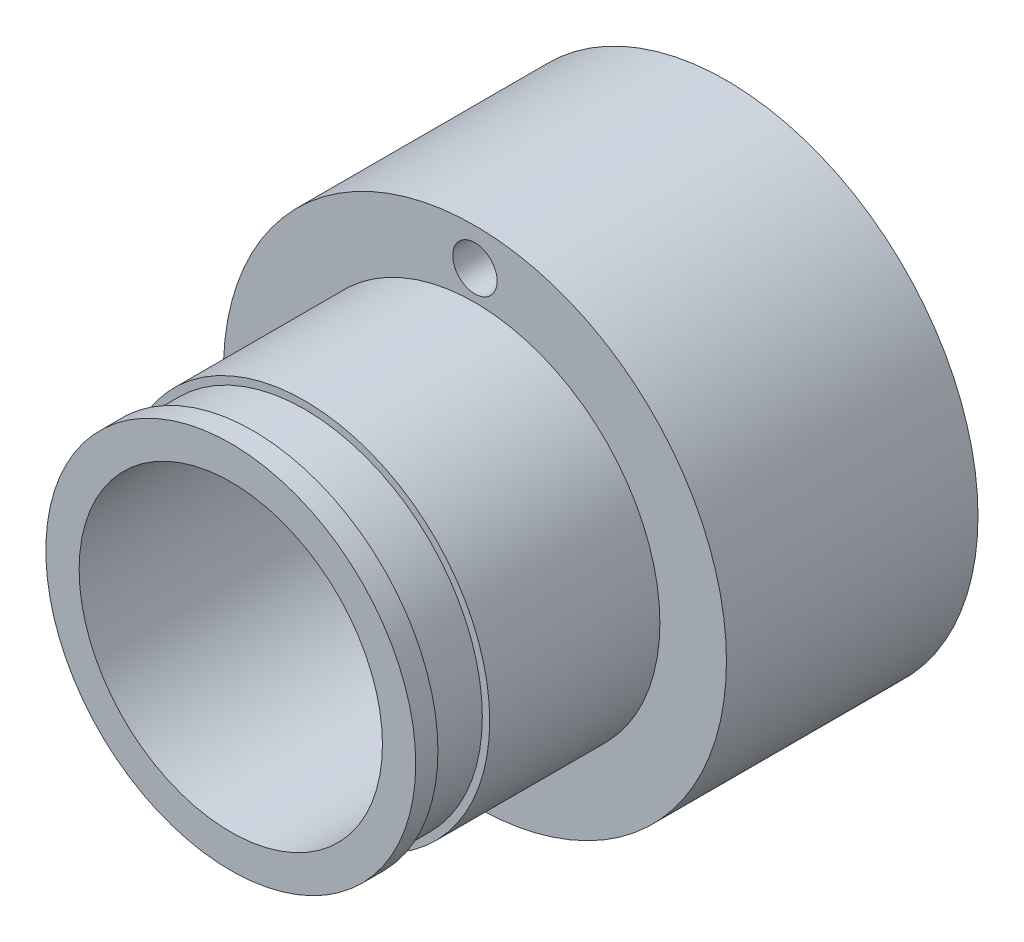
ISO-10303-21;
HEADER;
FILE_DESCRIPTION(('STEP AP214'),'2;1');
FILE_NAME('part.step','',(''),(''),'','','');
FILE_SCHEMA(('AUTOMOTIVE_DESIGN { 1 0 10303 214 1 1 1 1 }'));
ENDSEC;
DATA;
#1=APPLICATION_CONTEXT('core data for automotive mechanical design processes');
#2=APPLICATION_PROTOCOL_DEFINITION('international standard','automotive_design',2000,#1);
#3=PRODUCT_CONTEXT('',#1,'mechanical');
#4=PRODUCT('Part','Part','',(#3));
#5=PRODUCT_RELATED_PRODUCT_CATEGORY('part','',(#4));
#6=PRODUCT_DEFINITION_FORMATION('','',#4);
#7=PRODUCT_DEFINITION_CONTEXT('part definition',#1,'design');
#8=PRODUCT_DEFINITION('design','',#6,#7);
#9=PRODUCT_DEFINITION_SHAPE('','',#8);
#10=(LENGTH_UNIT() NAMED_UNIT(*) SI_UNIT(.MILLI.,.METRE.));
#11=(NAMED_UNIT(*) PLANE_ANGLE_UNIT() SI_UNIT($,.RADIAN.));
#12=(NAMED_UNIT(*) SI_UNIT($,.STERADIAN.) SOLID_ANGLE_UNIT());
#13=UNCERTAINTY_MEASURE_WITH_UNIT(LENGTH_MEASURE(1.E-05),#10,'distance_accuracy_value','');
#14=(GEOMETRIC_REPRESENTATION_CONTEXT(3) GLOBAL_UNCERTAINTY_ASSIGNED_CONTEXT((#13)) GLOBAL_UNIT_ASSIGNED_CONTEXT((#10,
#11,#12)) REPRESENTATION_CONTEXT('',''));
#15=CARTESIAN_POINT('',(0.,0.,0.));
#16=DIRECTION('',(0.,0.,1.));
#17=DIRECTION('',(1.,0.,0.));
#18=AXIS2_PLACEMENT_3D('',#15,#16,#17);
#19=CARTESIAN_POINT('',(0.,0.,17.));
#20=DIRECTION('',(0.,0.,-1.));
#21=DIRECTION('',(-1.,0.,0.));
#22=AXIS2_PLACEMENT_3D('',#19,#20,#21);
#23=CYLINDRICAL_SURFACE('',#22,17.);
#24=CARTESIAN_POINT('',(0.,0.,17.));
#25=DIRECTION('',(0.,0.,1.));
#26=DIRECTION('',(1.,0.,0.));
#27=AXIS2_PLACEMENT_3D('',#24,#25,#26);
#28=CIRCLE('',#27,17.);
#29=CARTESIAN_POINT('',(17.,0.,17.));
#30=VERTEX_POINT('',#29);
#31=EDGE_CURVE('E132',#30,#30,#28,.T.);
#32=ORIENTED_EDGE('',*,*,#31,.F.);
#33=EDGE_LOOP('',(#32));
#34=FACE_BOUND('',#33,.T.);
#35=CARTESIAN_POINT('',(0.,0.,0.));
#36=DIRECTION('',(0.,0.,1.));
#37=DIRECTION('',(1.,0.,0.));
#38=AXIS2_PLACEMENT_3D('',#35,#36,#37);
#39=CIRCLE('',#38,17.);
#40=CARTESIAN_POINT('',(17.,0.,0.));
#41=VERTEX_POINT('',#40);
#42=EDGE_CURVE('E56',#41,#41,#39,.T.);
#43=ORIENTED_EDGE('',*,*,#42,.T.);
#44=EDGE_LOOP('',(#43));
#45=FACE_BOUND('',#44,.T.);
#46=ADVANCED_FACE('F53',(#34,#45),#23,.T.);
#47=CARTESIAN_POINT('',(0.,0.,17.));
#48=DIRECTION('',(0.,0.,1.));
#49=DIRECTION('',(1.,0.,0.));
#50=AXIS2_PLACEMENT_3D('',#47,#48,#49);
#51=PLANE('',#50);
#52=CARTESIAN_POINT('',(0.,14.5,17.));
#53=DIRECTION('',(0.,0.,1.));
#54=DIRECTION('',(1.,0.,0.));
#55=AXIS2_PLACEMENT_3D('',#52,#53,#54);
#56=CIRCLE('',#55,1.49999999999999);
#57=CARTESIAN_POINT('',(1.49999999999999,14.5,17.));
#58=VERTEX_POINT('',#57);
#59=EDGE_CURVE('E77',#58,#58,#56,.T.);
#60=ORIENTED_EDGE('',*,*,#59,.F.);
#61=EDGE_LOOP('',(#60));
#62=FACE_BOUND('',#61,.T.);
#63=CARTESIAN_POINT('',(0.,0.,17.));
#64=DIRECTION('',(0.,0.,1.));
#65=DIRECTION('',(1.,0.,0.));
#66=AXIS2_PLACEMENT_3D('',#63,#64,#65);
#67=CIRCLE('',#66,12.5);
#68=CARTESIAN_POINT('',(12.5,0.,17.));
#69=VERTEX_POINT('',#68);
#70=EDGE_CURVE('E61',#69,#69,#67,.T.);
#71=ORIENTED_EDGE('',*,*,#70,.F.);
#72=EDGE_LOOP('',(#71));
#73=FACE_BOUND('',#72,.T.);
#74=ORIENTED_EDGE('',*,*,#31,.T.);
#75=EDGE_LOOP('',(#74));
#76=FACE_BOUND('',#75,.T.);
#77=ADVANCED_FACE('F145',(#62,#73,#76),#51,.T.);
#78=CARTESIAN_POINT('',(0.,0.,0.));
#79=DIRECTION('',(0.,0.,1.));
#80=DIRECTION('',(1.,0.,0.));
#81=AXIS2_PLACEMENT_3D('',#78,#79,#80);
#82=PLANE('',#81);
#83=ORIENTED_EDGE('',*,*,#42,.F.);
#84=EDGE_LOOP('',(#83));
#85=FACE_BOUND('',#84,.T.);
#86=ADVANCED_FACE('F142',(#85),#82,.F.);
#87=CARTESIAN_POINT('',(0.,0.,28.5));
#88=DIRECTION('',(0.,0.,-1.));
#89=DIRECTION('',(-1.,0.,0.));
#90=AXIS2_PLACEMENT_3D('',#87,#88,#89);
#91=CYLINDRICAL_SURFACE('',#90,12.5);
#92=CARTESIAN_POINT('',(0.,0.,28.5));
#93=DIRECTION('',(0.,0.,1.));
#94=DIRECTION('',(1.,0.,0.));
#95=AXIS2_PLACEMENT_3D('',#92,#93,#94);
#96=CIRCLE('',#95,12.5);
#97=CARTESIAN_POINT('',(12.5,0.,28.5));
#98=VERTEX_POINT('',#97);
#99=EDGE_CURVE('E125',#98,#98,#96,.T.);
#100=ORIENTED_EDGE('',*,*,#99,.F.);
#101=EDGE_LOOP('',(#100));
#102=FACE_BOUND('',#101,.T.);
#103=ORIENTED_EDGE('',*,*,#70,.T.);
#104=EDGE_LOOP('',(#103));
#105=FACE_BOUND('',#104,.T.);
#106=ADVANCED_FACE('F144',(#102,#105),#91,.T.);
#107=CARTESIAN_POINT('',(0.,0.,28.5));
#108=DIRECTION('',(0.,0.,1.));
#109=DIRECTION('',(1.,0.,0.));
#110=AXIS2_PLACEMENT_3D('',#107,#108,#109);
#111=PLANE('',#110);
#112=CARTESIAN_POINT('',(0.,0.,28.5));
#113=DIRECTION('',(0.,0.,1.));
#114=DIRECTION('',(1.,0.,0.));
#115=AXIS2_PLACEMENT_3D('',#112,#113,#114);
#116=CIRCLE('',#115,12.);
#117=CARTESIAN_POINT('',(12.,0.,28.5));
#118=VERTEX_POINT('',#117);
#119=EDGE_CURVE('E11',#118,#118,#116,.T.);
#120=ORIENTED_EDGE('',*,*,#119,.F.);
#121=EDGE_LOOP('',(#120));
#122=FACE_BOUND('',#121,.T.);
#123=ORIENTED_EDGE('',*,*,#99,.T.);
#124=EDGE_LOOP('',(#123));
#125=FACE_BOUND('',#124,.T.);
#126=ADVANCED_FACE('F150',(#122,#125),#111,.T.);
#127=CARTESIAN_POINT('',(0.,0.,32.));
#128=DIRECTION('',(0.,0.,-1.));
#129=DIRECTION('',(-1.,0.,0.));
#130=AXIS2_PLACEMENT_3D('',#127,#128,#129);
#131=CYLINDRICAL_SURFACE('',#130,12.);
#132=CARTESIAN_POINT('',(0.,0.,32.));
#133=DIRECTION('',(0.,0.,1.));
#134=DIRECTION('',(1.,0.,0.));
#135=AXIS2_PLACEMENT_3D('',#132,#133,#134);
#136=CIRCLE('',#135,12.);
#137=CARTESIAN_POINT('',(12.,0.,32.));
#138=VERTEX_POINT('',#137);
#139=EDGE_CURVE('E119',#138,#138,#136,.T.);
#140=ORIENTED_EDGE('',*,*,#139,.F.);
#141=EDGE_LOOP('',(#140));
#142=FACE_BOUND('',#141,.T.);
#143=ORIENTED_EDGE('',*,*,#119,.T.);
#144=EDGE_LOOP('',(#143));
#145=FACE_BOUND('',#144,.T.);
#146=ADVANCED_FACE('F186',(#142,#145),#131,.T.);
#147=CARTESIAN_POINT('',(0.,0.,33.5));
#148=DIRECTION('',(0.,0.,-1.));
#149=DIRECTION('',(-1.,0.,0.));
#150=AXIS2_PLACEMENT_3D('',#147,#148,#149);
#151=CYLINDRICAL_SURFACE('',#150,12.5);
#152=CARTESIAN_POINT('',(0.,0.,33.5));
#153=DIRECTION('',(0.,0.,1.));
#154=DIRECTION('',(1.,0.,0.));
#155=AXIS2_PLACEMENT_3D('',#152,#153,#154);
#156=CIRCLE('',#155,12.5);
#157=CARTESIAN_POINT('',(12.5,0.,33.5));
#158=VERTEX_POINT('',#157);
#159=EDGE_CURVE('E115',#158,#158,#156,.T.);
#160=ORIENTED_EDGE('',*,*,#159,.F.);
#161=EDGE_LOOP('',(#160));
#162=FACE_BOUND('',#161,.T.);
#163=CARTESIAN_POINT('',(0.,0.,32.));
#164=DIRECTION('',(0.,0.,1.));
#165=DIRECTION('',(1.,0.,0.));
#166=AXIS2_PLACEMENT_3D('',#163,#164,#165);
#167=CIRCLE('',#166,12.5);
#168=CARTESIAN_POINT('',(12.5,0.,32.));
#169=VERTEX_POINT('',#168);
#170=EDGE_CURVE('E114',#169,#169,#167,.T.);
#171=ORIENTED_EDGE('',*,*,#170,.T.);
#172=EDGE_LOOP('',(#171));
#173=FACE_BOUND('',#172,.T.);
#174=ADVANCED_FACE('F196',(#162,#173),#151,.T.);
#175=CARTESIAN_POINT('',(0.,0.,33.5));
#176=DIRECTION('',(0.,0.,1.));
#177=DIRECTION('',(1.,0.,0.));
#178=AXIS2_PLACEMENT_3D('',#175,#176,#177);
#179=PLANE('',#178);
#180=CARTESIAN_POINT('',(0.,0.,33.5));
#181=DIRECTION('',(0.,0.,1.));
#182=DIRECTION('',(1.,0.,0.));
#183=AXIS2_PLACEMENT_3D('',#180,#181,#182);
#184=CIRCLE('',#183,10.25);
#185=CARTESIAN_POINT('',(10.25,0.,33.5));
#186=VERTEX_POINT('',#185);
#187=EDGE_CURVE('E110',#186,#186,#184,.T.);
#188=ORIENTED_EDGE('',*,*,#187,.F.);
#189=EDGE_LOOP('',(#188));
#190=FACE_BOUND('',#189,.T.);
#191=ORIENTED_EDGE('',*,*,#159,.T.);
#192=EDGE_LOOP('',(#191));
#193=FACE_BOUND('',#192,.T.);
#194=ADVANCED_FACE('F207',(#190,#193),#179,.T.);
#195=CARTESIAN_POINT('',(0.,0.,32.));
#196=DIRECTION('',(0.,0.,1.));
#197=DIRECTION('',(1.,0.,0.));
#198=AXIS2_PLACEMENT_3D('',#195,#196,#197);
#199=PLANE('',#198);
#200=ORIENTED_EDGE('',*,*,#139,.T.);
#201=EDGE_LOOP('',(#200));
#202=FACE_BOUND('',#201,.T.);
#203=ORIENTED_EDGE('',*,*,#170,.F.);
#204=EDGE_LOOP('',(#203));
#205=FACE_BOUND('',#204,.T.);
#206=ADVANCED_FACE('F219',(#202,#205),#199,.F.);
#207=CARTESIAN_POINT('',(0.,0.,3.5));
#208=DIRECTION('',(0.,0.,1.));
#209=DIRECTION('',(1.,0.,0.));
#210=AXIS2_PLACEMENT_3D('',#207,#208,#209);
#211=CYLINDRICAL_SURFACE('',#210,10.25);
#212=CARTESIAN_POINT('',(0.,0.,5.5));
#213=DIRECTION('',(0.,0.,1.));
#214=DIRECTION('',(1.,0.,0.));
#215=AXIS2_PLACEMENT_3D('',#212,#213,#214);
#216=CIRCLE('',#215,10.25);
#217=CARTESIAN_POINT('',(10.25,0.,5.5));
#218=VERTEX_POINT('',#217);
#219=EDGE_CURVE('E82',#218,#218,#216,.T.);
#220=ORIENTED_EDGE('',*,*,#219,.F.);
#221=EDGE_LOOP('',(#220));
#222=FACE_BOUND('',#221,.T.);
#223=ORIENTED_EDGE('',*,*,#187,.T.);
#224=EDGE_LOOP('',(#223));
#225=FACE_BOUND('',#224,.T.);
#226=ADVANCED_FACE('F229',(#222,#225),#211,.F.);
#227=CARTESIAN_POINT('',(0.,0.,5.5));
#228=DIRECTION('',(0.,0.,1.));
#229=DIRECTION('',(1.,0.,0.));
#230=AXIS2_PLACEMENT_3D('',#227,#228,#229);
#231=PLANE('',#230);
#232=CARTESIAN_POINT('',(0.,0.,5.5));
#233=DIRECTION('',(0.,0.,1.));
#234=DIRECTION('',(1.,0.,0.));
#235=AXIS2_PLACEMENT_3D('',#232,#233,#234);
#236=CIRCLE('',#235,12.);
#237=CARTESIAN_POINT('',(12.,0.,5.5));
#238=VERTEX_POINT('',#237);
#239=EDGE_CURVE('E91',#238,#238,#236,.T.);
#240=ORIENTED_EDGE('',*,*,#239,.F.);
#241=EDGE_LOOP('',(#240));
#242=FACE_BOUND('',#241,.T.);
#243=ORIENTED_EDGE('',*,*,#219,.T.);
#244=EDGE_LOOP('',(#243));
#245=FACE_BOUND('',#244,.T.);
#246=ADVANCED_FACE('F240',(#242,#245),#231,.F.);
#247=CARTESIAN_POINT('',(0.,0.,3.5));
#248=DIRECTION('',(0.,0.,1.));
#249=DIRECTION('',(1.,0.,0.));
#250=AXIS2_PLACEMENT_3D('',#247,#248,#249);
#251=PLANE('',#250);
#252=CARTESIAN_POINT('',(0.,0.,3.5));
#253=DIRECTION('',(0.,0.,1.));
#254=DIRECTION('',(1.,0.,0.));
#255=AXIS2_PLACEMENT_3D('',#252,#253,#254);
#256=CIRCLE('',#255,12.);
#257=CARTESIAN_POINT('',(12.,0.,3.5));
#258=VERTEX_POINT('',#257);
#259=EDGE_CURVE('E89',#258,#258,#256,.T.);
#260=ORIENTED_EDGE('',*,*,#259,.T.);
#261=EDGE_LOOP('',(#260));
#262=FACE_BOUND('',#261,.T.);
#263=CARTESIAN_POINT('',(0.,0.,3.5));
#264=DIRECTION('',(0.,0.,1.));
#265=DIRECTION('',(1.,0.,0.));
#266=AXIS2_PLACEMENT_3D('',#263,#264,#265);
#267=CIRCLE('',#266,10.25);
#268=CARTESIAN_POINT('',(10.25,0.,3.5));
#269=VERTEX_POINT('',#268);
#270=EDGE_CURVE('E76',#269,#269,#267,.T.);
#271=ORIENTED_EDGE('',*,*,#270,.F.);
#272=EDGE_LOOP('',(#271));
#273=FACE_BOUND('',#272,.T.);
#274=ADVANCED_FACE('F289',(#262,#273),#251,.T.);
#275=CARTESIAN_POINT('',(0.,0.,5.5));
#276=DIRECTION('',(0.,0.,-1.));
#277=DIRECTION('',(-1.,0.,0.));
#278=AXIS2_PLACEMENT_3D('',#275,#276,#277);
#279=CYLINDRICAL_SURFACE('',#278,12.);
#280=ORIENTED_EDGE('',*,*,#239,.T.);
#281=EDGE_LOOP('',(#280));
#282=FACE_BOUND('',#281,.T.);
#283=ORIENTED_EDGE('',*,*,#259,.F.);
#284=EDGE_LOOP('',(#283));
#285=FACE_BOUND('',#284,.T.);
#286=ADVANCED_FACE('F254',(#282,#285),#279,.F.);
#287=CARTESIAN_POINT('',(0.,0.,3.5));
#288=DIRECTION('',(0.,0.,1.));
#289=DIRECTION('',(1.,0.,0.));
#290=AXIS2_PLACEMENT_3D('',#287,#288,#289);
#291=PLANE('',#290);
#292=CARTESIAN_POINT('',(0.,0.,3.5));
#293=DIRECTION('',(0.,0.,1.));
#294=DIRECTION('',(1.,0.,0.));
#295=AXIS2_PLACEMENT_3D('',#292,#293,#294);
#296=CIRCLE('',#295,6.75);
#297=CARTESIAN_POINT('',(6.75,0.,3.5));
#298=VERTEX_POINT('',#297);
#299=EDGE_CURVE('E95',#298,#298,#296,.T.);
#300=ORIENTED_EDGE('',*,*,#299,.T.);
#301=EDGE_LOOP('',(#300));
#302=FACE_BOUND('',#301,.T.);
#303=ADVANCED_FACE('F249',(#302),#291,.T.);
#304=CARTESIAN_POINT('',(0.,0.,2.));
#305=DIRECTION('',(0.,0.,1.));
#306=DIRECTION('',(1.,0.,0.));
#307=AXIS2_PLACEMENT_3D('',#304,#305,#306);
#308=CYLINDRICAL_SURFACE('',#307,6.75);
#309=CARTESIAN_POINT('',(0.,0.,2.));
#310=DIRECTION('',(0.,0.,1.));
#311=DIRECTION('',(1.,0.,0.));
#312=AXIS2_PLACEMENT_3D('',#309,#310,#311);
#313=CIRCLE('',#312,6.75);
#314=CARTESIAN_POINT('',(6.75,0.,2.));
#315=VERTEX_POINT('',#314);
#316=EDGE_CURVE('E99',#315,#315,#313,.T.);
#317=ORIENTED_EDGE('',*,*,#316,.T.);
#318=EDGE_LOOP('',(#317));
#319=FACE_BOUND('',#318,.T.);
#320=ORIENTED_EDGE('',*,*,#299,.F.);
#321=EDGE_LOOP('',(#320));
#322=FACE_BOUND('',#321,.T.);
#323=ADVANCED_FACE('F253',(#319,#322),#308,.T.);
#324=CARTESIAN_POINT('',(0.,0.,2.));
#325=DIRECTION('',(0.,0.,1.));
#326=DIRECTION('',(1.,0.,0.));
#327=AXIS2_PLACEMENT_3D('',#324,#325,#326);
#328=PLANE('',#327);
#329=ORIENTED_EDGE('',*,*,#316,.F.);
#330=EDGE_LOOP('',(#329));
#331=FACE_BOUND('',#330,.T.);
#332=CARTESIAN_POINT('',(0.,0.,2.));
#333=DIRECTION('',(0.,0.,1.));
#334=DIRECTION('',(1.,0.,0.));
#335=AXIS2_PLACEMENT_3D('',#332,#333,#334);
#336=CIRCLE('',#335,10.25);
#337=CARTESIAN_POINT('',(10.25,0.,2.));
#338=VERTEX_POINT('',#337);
#339=EDGE_CURVE('E103',#338,#338,#336,.T.);
#340=ORIENTED_EDGE('',*,*,#339,.T.);
#341=EDGE_LOOP('',(#340));
#342=FACE_BOUND('',#341,.T.);
#343=ADVANCED_FACE('F262',(#331,#342),#328,.T.);
#344=ORIENTED_EDGE('',*,*,#339,.F.);
#345=EDGE_LOOP('',(#344));
#346=FACE_BOUND('',#345,.T.);
#347=ORIENTED_EDGE('',*,*,#270,.T.);
#348=EDGE_LOOP('',(#347));
#349=FACE_BOUND('',#348,.T.);
#350=ADVANCED_FACE('F69',(#346,#349),#211,.F.);
#351=CARTESIAN_POINT('',(0.,14.5,5.));
#352=DIRECTION('',(0.,0.,1.));
#353=DIRECTION('',(1.,0.,0.));
#354=AXIS2_PLACEMENT_3D('',#351,#352,#353);
#355=CONICAL_SURFACE('',#354,1.5,1.02974425867665);
#356=CARTESIAN_POINT('',(0.,14.5,4.09870907145866));
#357=VERTEX_POINT('',#356);
#358=VERTEX_LOOP('',#357);
#359=FACE_BOUND('',#358,.T.);
#360=CARTESIAN_POINT('',(0.,14.5,5.));
#361=DIRECTION('',(0.,0.,1.));
#362=DIRECTION('',(1.,0.,0.));
#363=AXIS2_PLACEMENT_3D('',#360,#361,#362);
#364=CIRCLE('',#363,1.5);
#365=CARTESIAN_POINT('',(1.5,14.5,5.));
#366=VERTEX_POINT('',#365);
#367=EDGE_CURVE('E73',#366,#366,#364,.T.);
#368=ORIENTED_EDGE('',*,*,#367,.T.);
#369=EDGE_LOOP('',(#368));
#370=FACE_BOUND('',#369,.T.);
#371=ADVANCED_FACE('F65',(#359,#370),#355,.F.);
#372=CARTESIAN_POINT('',(0.,14.5,17.));
#373=DIRECTION('',(0.,0.,1.));
#374=DIRECTION('',(1.,0.,0.));
#375=AXIS2_PLACEMENT_3D('',#372,#373,#374);
#376=CYLINDRICAL_SURFACE('',#375,1.49999999999999);
#377=ORIENTED_EDGE('',*,*,#367,.F.);
#378=EDGE_LOOP('',(#377));
#379=FACE_BOUND('',#378,.T.);
#380=ORIENTED_EDGE('',*,*,#59,.T.);
#381=EDGE_LOOP('',(#380));
#382=FACE_BOUND('',#381,.T.);
#383=ADVANCED_FACE('F68',(#379,#382),#376,.F.);
#384=CLOSED_SHELL('',(#46,#77,#86,#106,#126,#146,#174,#194,#206,#226,#246,#274,#286,#303,#323,
#343,#350,#371,#383));
#385=MANIFOLD_SOLID_BREP('B2',#384);
#386=ADVANCED_BREP_SHAPE_REPRESENTATION('',(#18,#385),#14);
#387=SHAPE_DEFINITION_REPRESENTATION(#9,#386);
ENDSEC;
END-ISO-10303-21;
